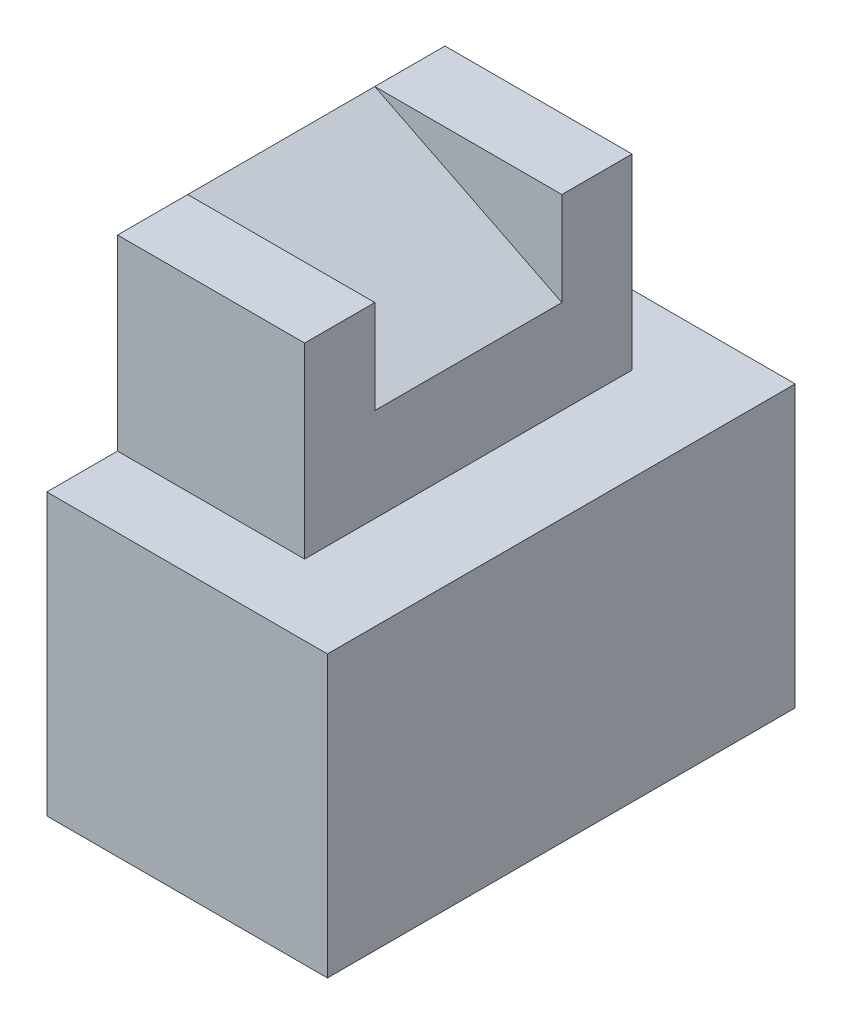
ISO-10303-21;
HEADER;
FILE_DESCRIPTION(('STEP AP214'),'2;1');
FILE_NAME('part.step','',(''),(''),'','','');
FILE_SCHEMA(('AUTOMOTIVE_DESIGN { 1 0 10303 214 1 1 1 1 }'));
ENDSEC;
DATA;
#1=APPLICATION_CONTEXT('core data for automotive mechanical design processes');
#2=APPLICATION_PROTOCOL_DEFINITION('international standard','automotive_design',2000,#1);
#3=PRODUCT_CONTEXT('',#1,'mechanical');
#4=PRODUCT('Part','Part','',(#3));
#5=PRODUCT_RELATED_PRODUCT_CATEGORY('part','',(#4));
#6=PRODUCT_DEFINITION_FORMATION('','',#4);
#7=PRODUCT_DEFINITION_CONTEXT('part definition',#1,'design');
#8=PRODUCT_DEFINITION('design','',#6,#7);
#9=PRODUCT_DEFINITION_SHAPE('','',#8);
#10=(LENGTH_UNIT() NAMED_UNIT(*) SI_UNIT(.MILLI.,.METRE.));
#11=(NAMED_UNIT(*) PLANE_ANGLE_UNIT() SI_UNIT($,.RADIAN.));
#12=(NAMED_UNIT(*) SI_UNIT($,.STERADIAN.) SOLID_ANGLE_UNIT());
#13=UNCERTAINTY_MEASURE_WITH_UNIT(LENGTH_MEASURE(1.E-05),#10,'distance_accuracy_value','');
#14=(GEOMETRIC_REPRESENTATION_CONTEXT(3) GLOBAL_UNCERTAINTY_ASSIGNED_CONTEXT((#13)) GLOBAL_UNIT_ASSIGNED_CONTEXT((#10,
#11,#12)) REPRESENTATION_CONTEXT('',''));
#15=CARTESIAN_POINT('',(0.,0.,0.));
#16=DIRECTION('',(0.,0.,1.));
#17=DIRECTION('',(1.,0.,0.));
#18=AXIS2_PLACEMENT_3D('',#15,#16,#17);
#19=CARTESIAN_POINT('',(-3.,8.,-2.0123607818523));
#20=DIRECTION('',(0.,0.,-1.));
#21=DIRECTION('',(-1.,0.,0.));
#22=AXIS2_PLACEMENT_3D('',#19,#20,#21);
#23=PLANE('',#22);
#24=DIRECTION('',(-0.894427190999916,0.447213595499958,0.));
#25=VECTOR('',#24,1.);
#26=CARTESIAN_POINT('',(-3.,10.,-2.0123607818523));
#27=LINE('',#26,#25);
#28=CARTESIAN_POINT('',(0.999999999999998,8.,-2.0123607818523));
#29=VERTEX_POINT('',#28);
#30=CARTESIAN_POINT('',(-3.,10.,-2.0123607818523));
#31=VERTEX_POINT('',#30);
#32=EDGE_CURVE('E141',#29,#31,#27,.T.);
#33=ORIENTED_EDGE('',*,*,#32,.F.);
#34=DIRECTION('',(0.,1.,0.));
#35=VECTOR('',#34,1.);
#36=CARTESIAN_POINT('',(0.999999999999998,8.,-2.0123607818523));
#37=LINE('',#36,#35);
#38=CARTESIAN_POINT('',(0.999999999999998,10.,-2.0123607818523));
#39=VERTEX_POINT('',#38);
#40=EDGE_CURVE('E128',#29,#39,#37,.T.);
#41=ORIENTED_EDGE('',*,*,#40,.T.);
#42=DIRECTION('',(-1.,0.,0.));
#43=VECTOR('',#42,1.);
#44=CARTESIAN_POINT('',(-3.,10.,-2.0123607818523));
#45=LINE('',#44,#43);
#46=EDGE_CURVE('E142',#39,#31,#45,.T.);
#47=ORIENTED_EDGE('',*,*,#46,.T.);
#48=EDGE_LOOP('',(#33,#41,#47));
#49=FACE_BOUND('',#48,.T.);
#50=ADVANCED_FACE('F45',(#49),#23,.F.);
#51=CARTESIAN_POINT('',(-3.,8.,1.9876392181477));
#52=DIRECTION('',(0.,0.,1.));
#53=DIRECTION('',(1.,0.,0.));
#54=AXIS2_PLACEMENT_3D('',#51,#52,#53);
#55=PLANE('',#54);
#56=DIRECTION('',(-0.894427190999916,0.447213595499958,0.));
#57=VECTOR('',#56,1.);
#58=CARTESIAN_POINT('',(-3.,10.,1.9876392181477));
#59=LINE('',#58,#57);
#60=CARTESIAN_POINT('',(0.999999999999998,8.,1.9876392181477));
#61=VERTEX_POINT('',#60);
#62=CARTESIAN_POINT('',(-3.,10.,1.9876392181477));
#63=VERTEX_POINT('',#62);
#64=EDGE_CURVE('E60',#61,#63,#59,.T.);
#65=ORIENTED_EDGE('',*,*,#64,.T.);
#66=DIRECTION('',(1.,0.,0.));
#67=VECTOR('',#66,1.);
#68=CARTESIAN_POINT('',(-3.,10.,1.9876392181477));
#69=LINE('',#68,#67);
#70=CARTESIAN_POINT('',(0.999999999999998,10.,1.9876392181477));
#71=VERTEX_POINT('',#70);
#72=EDGE_CURVE('E149',#63,#71,#69,.T.);
#73=ORIENTED_EDGE('',*,*,#72,.T.);
#74=DIRECTION('',(0.,1.,0.));
#75=VECTOR('',#74,1.);
#76=CARTESIAN_POINT('',(0.999999999999998,8.,1.9876392181477));
#77=LINE('',#76,#75);
#78=EDGE_CURVE('E138',#61,#71,#77,.T.);
#79=ORIENTED_EDGE('',*,*,#78,.F.);
#80=EDGE_LOOP('',(#65,#73,#79));
#81=FACE_BOUND('',#80,.T.);
#82=ADVANCED_FACE('F247',(#81),#55,.F.);
#83=CARTESIAN_POINT('',(0.,10.,0.));
#84=DIRECTION('',(0.,1.,0.));
#85=DIRECTION('',(0.,0.,1.));
#86=AXIS2_PLACEMENT_3D('',#83,#84,#85);
#87=PLANE('',#86);
#88=ORIENTED_EDGE('',*,*,#46,.F.);
#89=DIRECTION('',(0.,0.,-1.));
#90=VECTOR('',#89,1.);
#91=CARTESIAN_POINT('',(0.999999999999998,10.,0.));
#92=LINE('',#91,#90);
#93=CARTESIAN_POINT('',(0.999999999999998,10.,-3.5123607818523));
#94=VERTEX_POINT('',#93);
#95=EDGE_CURVE('E135',#39,#94,#92,.T.);
#96=ORIENTED_EDGE('',*,*,#95,.T.);
#97=DIRECTION('',(1.,0.,0.));
#98=VECTOR('',#97,1.);
#99=CARTESIAN_POINT('',(0.,10.,-3.5123607818523));
#100=LINE('',#99,#98);
#101=CARTESIAN_POINT('',(-3.,10.,-3.5123607818523));
#102=VERTEX_POINT('',#101);
#103=EDGE_CURVE('E157',#102,#94,#100,.T.);
#104=ORIENTED_EDGE('',*,*,#103,.F.);
#105=DIRECTION('',(0.,0.,1.));
#106=VECTOR('',#105,1.);
#107=CARTESIAN_POINT('',(-3.,10.,0.));
#108=LINE('',#107,#106);
#109=EDGE_CURVE('E162',#102,#31,#108,.T.);
#110=ORIENTED_EDGE('',*,*,#109,.T.);
#111=EDGE_LOOP('',(#88,#96,#104,#110));
#112=FACE_BOUND('',#111,.T.);
#113=ADVANCED_FACE('F244',(#112),#87,.T.);
#114=CARTESIAN_POINT('',(0.,6.,0.));
#115=DIRECTION('',(0.,1.,0.));
#116=DIRECTION('',(0.,0.,1.));
#117=AXIS2_PLACEMENT_3D('',#114,#115,#116);
#118=PLANE('',#117);
#119=DIRECTION('',(0.,0.,1.));
#120=VECTOR('',#119,1.);
#121=CARTESIAN_POINT('',(-3.,6.,-5.));
#122=LINE('',#121,#120);
#123=CARTESIAN_POINT('',(-3.,6.,-5.));
#124=VERTEX_POINT('',#123);
#125=CARTESIAN_POINT('',(-3.,6.,-3.5123607818523));
#126=VERTEX_POINT('',#125);
#127=EDGE_CURVE('E194',#124,#126,#122,.T.);
#128=ORIENTED_EDGE('',*,*,#127,.T.);
#129=DIRECTION('',(1.,0.,0.));
#130=VECTOR('',#129,1.);
#131=CARTESIAN_POINT('',(0.,6.,-3.5123607818523));
#132=LINE('',#131,#130);
#133=CARTESIAN_POINT('',(0.999999999999998,6.,-3.5123607818523));
#134=VERTEX_POINT('',#133);
#135=EDGE_CURVE('E68',#126,#134,#132,.T.);
#136=ORIENTED_EDGE('',*,*,#135,.T.);
#137=DIRECTION('',(0.,0.,-1.));
#138=VECTOR('',#137,1.);
#139=CARTESIAN_POINT('',(0.999999999999998,6.,0.));
#140=LINE('',#139,#138);
#141=CARTESIAN_POINT('',(0.999999999999998,6.,3.4876392181477));
#142=VERTEX_POINT('',#141);
#143=EDGE_CURVE('E161',#142,#134,#140,.T.);
#144=ORIENTED_EDGE('',*,*,#143,.F.);
#145=DIRECTION('',(1.,0.,0.));
#146=VECTOR('',#145,1.);
#147=CARTESIAN_POINT('',(0.,6.,3.4876392181477));
#148=LINE('',#147,#146);
#149=CARTESIAN_POINT('',(-3.,6.,3.48763921814771));
#150=VERTEX_POINT('',#149);
#151=EDGE_CURVE('E171',#150,#142,#148,.T.);
#152=ORIENTED_EDGE('',*,*,#151,.F.);
#153=CARTESIAN_POINT('',(-3.,6.,5.));
#154=VERTEX_POINT('',#153);
#155=EDGE_CURVE('E193',#150,#154,#122,.T.);
#156=ORIENTED_EDGE('',*,*,#155,.T.);
#157=DIRECTION('',(1.,0.,0.));
#158=VECTOR('',#157,1.);
#159=CARTESIAN_POINT('',(-3.,6.,5.));
#160=LINE('',#159,#158);
#161=CARTESIAN_POINT('',(3.,6.,5.));
#162=VERTEX_POINT('',#161);
#163=EDGE_CURVE('E196',#154,#162,#160,.T.);
#164=ORIENTED_EDGE('',*,*,#163,.T.);
#165=DIRECTION('',(0.,0.,-1.));
#166=VECTOR('',#165,1.);
#167=CARTESIAN_POINT('',(3.,6.,-5.));
#168=LINE('',#167,#166);
#169=CARTESIAN_POINT('',(3.,6.,-5.));
#170=VERTEX_POINT('',#169);
#171=EDGE_CURVE('E187',#162,#170,#168,.T.);
#172=ORIENTED_EDGE('',*,*,#171,.T.);
#173=DIRECTION('',(-1.,0.,0.));
#174=VECTOR('',#173,1.);
#175=CARTESIAN_POINT('',(-3.,6.,-5.));
#176=LINE('',#175,#174);
#177=EDGE_CURVE('E190',#170,#124,#176,.T.);
#178=ORIENTED_EDGE('',*,*,#177,.T.);
#179=EDGE_LOOP('',(#128,#136,#144,#152,#156,#164,#172,#178));
#180=FACE_BOUND('',#179,.T.);
#181=ADVANCED_FACE('F229',(#180),#118,.T.);
#182=CARTESIAN_POINT('',(3.,6.,-5.));
#183=DIRECTION('',(-1.,0.,0.));
#184=DIRECTION('',(0.,0.,1.));
#185=AXIS2_PLACEMENT_3D('',#182,#183,#184);
#186=PLANE('',#185);
#187=DIRECTION('',(0.,0.,-1.));
#188=VECTOR('',#187,1.);
#189=CARTESIAN_POINT('',(3.,0.,-5.));
#190=LINE('',#189,#188);
#191=CARTESIAN_POINT('',(3.,0.,5.));
#192=VERTEX_POINT('',#191);
#193=CARTESIAN_POINT('',(3.,0.,-5.));
#194=VERTEX_POINT('',#193);
#195=EDGE_CURVE('E186',#192,#194,#190,.T.);
#196=ORIENTED_EDGE('',*,*,#195,.T.);
#197=DIRECTION('',(0.,-1.,0.));
#198=VECTOR('',#197,1.);
#199=CARTESIAN_POINT('',(3.,6.,-5.));
#200=LINE('',#199,#198);
#201=EDGE_CURVE('E11',#170,#194,#200,.T.);
#202=ORIENTED_EDGE('',*,*,#201,.F.);
#203=ORIENTED_EDGE('',*,*,#171,.F.);
#204=DIRECTION('',(0.,-1.,0.));
#205=VECTOR('',#204,1.);
#206=CARTESIAN_POINT('',(3.,6.,5.));
#207=LINE('',#206,#205);
#208=EDGE_CURVE('E198',#162,#192,#207,.T.);
#209=ORIENTED_EDGE('',*,*,#208,.T.);
#210=EDGE_LOOP('',(#196,#202,#203,#209));
#211=FACE_BOUND('',#210,.T.);
#212=ADVANCED_FACE('F47',(#211),#186,.F.);
#213=CARTESIAN_POINT('',(-3.,6.,-5.));
#214=DIRECTION('',(0.,0.,1.));
#215=DIRECTION('',(1.,0.,0.));
#216=AXIS2_PLACEMENT_3D('',#213,#214,#215);
#217=PLANE('',#216);
#218=DIRECTION('',(-1.,0.,0.));
#219=VECTOR('',#218,1.);
#220=CARTESIAN_POINT('',(-3.,0.,-5.));
#221=LINE('',#220,#219);
#222=CARTESIAN_POINT('',(-3.,0.,-5.));
#223=VERTEX_POINT('',#222);
#224=EDGE_CURVE('E201',#194,#223,#221,.T.);
#225=ORIENTED_EDGE('',*,*,#224,.T.);
#226=DIRECTION('',(0.,-1.,0.));
#227=VECTOR('',#226,1.);
#228=CARTESIAN_POINT('',(-3.,6.,-5.));
#229=LINE('',#228,#227);
#230=EDGE_CURVE('E53',#124,#223,#229,.T.);
#231=ORIENTED_EDGE('',*,*,#230,.F.);
#232=ORIENTED_EDGE('',*,*,#177,.F.);
#233=ORIENTED_EDGE('',*,*,#201,.T.);
#234=EDGE_LOOP('',(#225,#231,#232,#233));
#235=FACE_BOUND('',#234,.T.);
#236=ADVANCED_FACE('F272',(#235),#217,.F.);
#237=CARTESIAN_POINT('',(-3.,6.,-5.));
#238=DIRECTION('',(1.,0.,0.));
#239=DIRECTION('',(0.,0.,-1.));
#240=AXIS2_PLACEMENT_3D('',#237,#238,#239);
#241=PLANE('',#240);
#242=DIRECTION('',(0.,0.,-1.));
#243=VECTOR('',#242,1.);
#244=CARTESIAN_POINT('',(-3.,10.,1.9876392181477));
#245=LINE('',#244,#243);
#246=EDGE_CURVE('E155',#63,#31,#245,.T.);
#247=ORIENTED_EDGE('',*,*,#246,.T.);
#248=ORIENTED_EDGE('',*,*,#109,.F.);
#249=DIRECTION('',(0.,-1.,0.));
#250=VECTOR('',#249,1.);
#251=CARTESIAN_POINT('',(-3.,10.,-3.5123607818523));
#252=LINE('',#251,#250);
#253=EDGE_CURVE('E183',#102,#126,#252,.T.);
#254=ORIENTED_EDGE('',*,*,#253,.T.);
#255=ORIENTED_EDGE('',*,*,#127,.F.);
#256=ORIENTED_EDGE('',*,*,#230,.T.);
#257=DIRECTION('',(0.,0.,1.));
#258=VECTOR('',#257,1.);
#259=CARTESIAN_POINT('',(-3.,0.,-5.));
#260=LINE('',#259,#258);
#261=CARTESIAN_POINT('',(-3.,0.,5.));
#262=VERTEX_POINT('',#261);
#263=EDGE_CURVE('E203',#223,#262,#260,.T.);
#264=ORIENTED_EDGE('',*,*,#263,.T.);
#265=DIRECTION('',(0.,-1.,0.));
#266=VECTOR('',#265,1.);
#267=CARTESIAN_POINT('',(-3.,6.,5.));
#268=LINE('',#267,#266);
#269=EDGE_CURVE('E208',#154,#262,#268,.T.);
#270=ORIENTED_EDGE('',*,*,#269,.F.);
#271=ORIENTED_EDGE('',*,*,#155,.F.);
#272=DIRECTION('',(0.,-1.,0.));
#273=VECTOR('',#272,1.);
#274=CARTESIAN_POINT('',(-3.,10.,3.4876392181477));
#275=LINE('',#274,#273);
#276=CARTESIAN_POINT('',(-3.,10.,3.4876392181477));
#277=VERTEX_POINT('',#276);
#278=EDGE_CURVE('E180',#277,#150,#275,.T.);
#279=ORIENTED_EDGE('',*,*,#278,.F.);
#280=EDGE_CURVE('E160',#63,#277,#108,.T.);
#281=ORIENTED_EDGE('',*,*,#280,.F.);
#282=EDGE_LOOP('',(#247,#248,#254,#255,#256,#264,#270,#271,#279,#281));
#283=FACE_BOUND('',#282,.T.);
#284=ADVANCED_FACE('F215',(#283),#241,.F.);
#285=CARTESIAN_POINT('',(-3.,6.,5.));
#286=DIRECTION('',(0.,0.,-1.));
#287=DIRECTION('',(-1.,0.,0.));
#288=AXIS2_PLACEMENT_3D('',#285,#286,#287);
#289=PLANE('',#288);
#290=DIRECTION('',(1.,0.,0.));
#291=VECTOR('',#290,1.);
#292=CARTESIAN_POINT('',(-3.,0.,5.));
#293=LINE('',#292,#291);
#294=EDGE_CURVE('E191',#262,#192,#293,.T.);
#295=ORIENTED_EDGE('',*,*,#294,.T.);
#296=ORIENTED_EDGE('',*,*,#208,.F.);
#297=ORIENTED_EDGE('',*,*,#163,.F.);
#298=ORIENTED_EDGE('',*,*,#269,.T.);
#299=EDGE_LOOP('',(#295,#296,#297,#298));
#300=FACE_BOUND('',#299,.T.);
#301=ADVANCED_FACE('F224',(#300),#289,.F.);
#302=CARTESIAN_POINT('',(0.,0.,0.));
#303=DIRECTION('',(0.,1.,0.));
#304=DIRECTION('',(0.,0.,1.));
#305=AXIS2_PLACEMENT_3D('',#302,#303,#304);
#306=PLANE('',#305);
#307=ORIENTED_EDGE('',*,*,#195,.F.);
#308=ORIENTED_EDGE('',*,*,#294,.F.);
#309=ORIENTED_EDGE('',*,*,#263,.F.);
#310=ORIENTED_EDGE('',*,*,#224,.F.);
#311=EDGE_LOOP('',(#307,#308,#309,#310));
#312=FACE_BOUND('',#311,.T.);
#313=ADVANCED_FACE('F221',(#312),#306,.F.);
#314=CARTESIAN_POINT('',(0.,10.,-3.5123607818523));
#315=DIRECTION('',(0.,0.,-1.));
#316=DIRECTION('',(-1.,0.,0.));
#317=AXIS2_PLACEMENT_3D('',#314,#315,#316);
#318=PLANE('',#317);
#319=ORIENTED_EDGE('',*,*,#135,.F.);
#320=ORIENTED_EDGE('',*,*,#253,.F.);
#321=ORIENTED_EDGE('',*,*,#103,.T.);
#322=DIRECTION('',(0.,-1.,0.));
#323=VECTOR('',#322,1.);
#324=CARTESIAN_POINT('',(0.999999999999998,10.,-3.5123607818523));
#325=LINE('',#324,#323);
#326=EDGE_CURVE('E169',#94,#134,#325,.T.);
#327=ORIENTED_EDGE('',*,*,#326,.T.);
#328=EDGE_LOOP('',(#319,#320,#321,#327));
#329=FACE_BOUND('',#328,.T.);
#330=ADVANCED_FACE('F246',(#329),#318,.T.);
#331=CARTESIAN_POINT('',(0.,10.,3.4876392181477));
#332=DIRECTION('',(0.,0.,-1.));
#333=DIRECTION('',(-1.,0.,0.));
#334=AXIS2_PLACEMENT_3D('',#331,#332,#333);
#335=PLANE('',#334);
#336=ORIENTED_EDGE('',*,*,#151,.T.);
#337=DIRECTION('',(0.,-1.,0.));
#338=VECTOR('',#337,1.);
#339=CARTESIAN_POINT('',(0.999999999999998,10.,3.4876392181477));
#340=LINE('',#339,#338);
#341=CARTESIAN_POINT('',(0.999999999999998,10.,3.4876392181477));
#342=VERTEX_POINT('',#341);
#343=EDGE_CURVE('E177',#342,#142,#340,.T.);
#344=ORIENTED_EDGE('',*,*,#343,.F.);
#345=DIRECTION('',(1.,0.,0.));
#346=VECTOR('',#345,1.);
#347=CARTESIAN_POINT('',(0.,10.,3.4876392181477));
#348=LINE('',#347,#346);
#349=EDGE_CURVE('E164',#277,#342,#348,.T.);
#350=ORIENTED_EDGE('',*,*,#349,.F.);
#351=ORIENTED_EDGE('',*,*,#278,.T.);
#352=EDGE_LOOP('',(#336,#344,#350,#351));
#353=FACE_BOUND('',#352,.T.);
#354=ADVANCED_FACE('F235',(#353),#335,.F.);
#355=CARTESIAN_POINT('',(0.999999999999998,10.,0.));
#356=DIRECTION('',(-1.,0.,0.));
#357=DIRECTION('',(0.,0.,1.));
#358=AXIS2_PLACEMENT_3D('',#355,#356,#357);
#359=PLANE('',#358);
#360=ORIENTED_EDGE('',*,*,#95,.F.);
#361=ORIENTED_EDGE('',*,*,#40,.F.);
#362=DIRECTION('',(0.,0.,-1.));
#363=VECTOR('',#362,1.);
#364=CARTESIAN_POINT('',(0.999999999999998,8.,-2.0123607818523));
#365=LINE('',#364,#363);
#366=EDGE_CURVE('E133',#61,#29,#365,.T.);
#367=ORIENTED_EDGE('',*,*,#366,.F.);
#368=ORIENTED_EDGE('',*,*,#78,.T.);
#369=EDGE_CURVE('E166',#342,#71,#92,.T.);
#370=ORIENTED_EDGE('',*,*,#369,.F.);
#371=ORIENTED_EDGE('',*,*,#343,.T.);
#372=ORIENTED_EDGE('',*,*,#143,.T.);
#373=ORIENTED_EDGE('',*,*,#326,.F.);
#374=EDGE_LOOP('',(#360,#361,#367,#368,#370,#371,#372,#373));
#375=FACE_BOUND('',#374,.T.);
#376=ADVANCED_FACE('F130',(#375),#359,.F.);
#377=ORIENTED_EDGE('',*,*,#72,.F.);
#378=ORIENTED_EDGE('',*,*,#280,.T.);
#379=ORIENTED_EDGE('',*,*,#349,.T.);
#380=ORIENTED_EDGE('',*,*,#369,.T.);
#381=EDGE_LOOP('',(#377,#378,#379,#380));
#382=FACE_BOUND('',#381,.T.);
#383=ADVANCED_FACE('F239',(#382),#87,.T.);
#384=CARTESIAN_POINT('',(-3.,10.,1.9876392181477));
#385=DIRECTION('',(-0.447213595499958,-0.894427190999916,0.));
#386=DIRECTION('',(0.894427190999916,-0.447213595499958,0.));
#387=AXIS2_PLACEMENT_3D('',#384,#385,#386);
#388=PLANE('',#387);
#389=ORIENTED_EDGE('',*,*,#32,.T.);
#390=ORIENTED_EDGE('',*,*,#246,.F.);
#391=ORIENTED_EDGE('',*,*,#64,.F.);
#392=ORIENTED_EDGE('',*,*,#366,.T.);
#393=EDGE_LOOP('',(#389,#390,#391,#392));
#394=FACE_BOUND('',#393,.T.);
#395=ADVANCED_FACE('F148',(#394),#388,.F.);
#396=CLOSED_SHELL('',(#50,#82,#113,#181,#212,#236,#284,#301,#313,#330,#354,#376,#383,#395));
#397=MANIFOLD_SOLID_BREP('B2',#396);
#398=ADVANCED_BREP_SHAPE_REPRESENTATION('',(#18,#397),#14);
#399=SHAPE_DEFINITION_REPRESENTATION(#9,#398);
ENDSEC;
END-ISO-10303-21;
